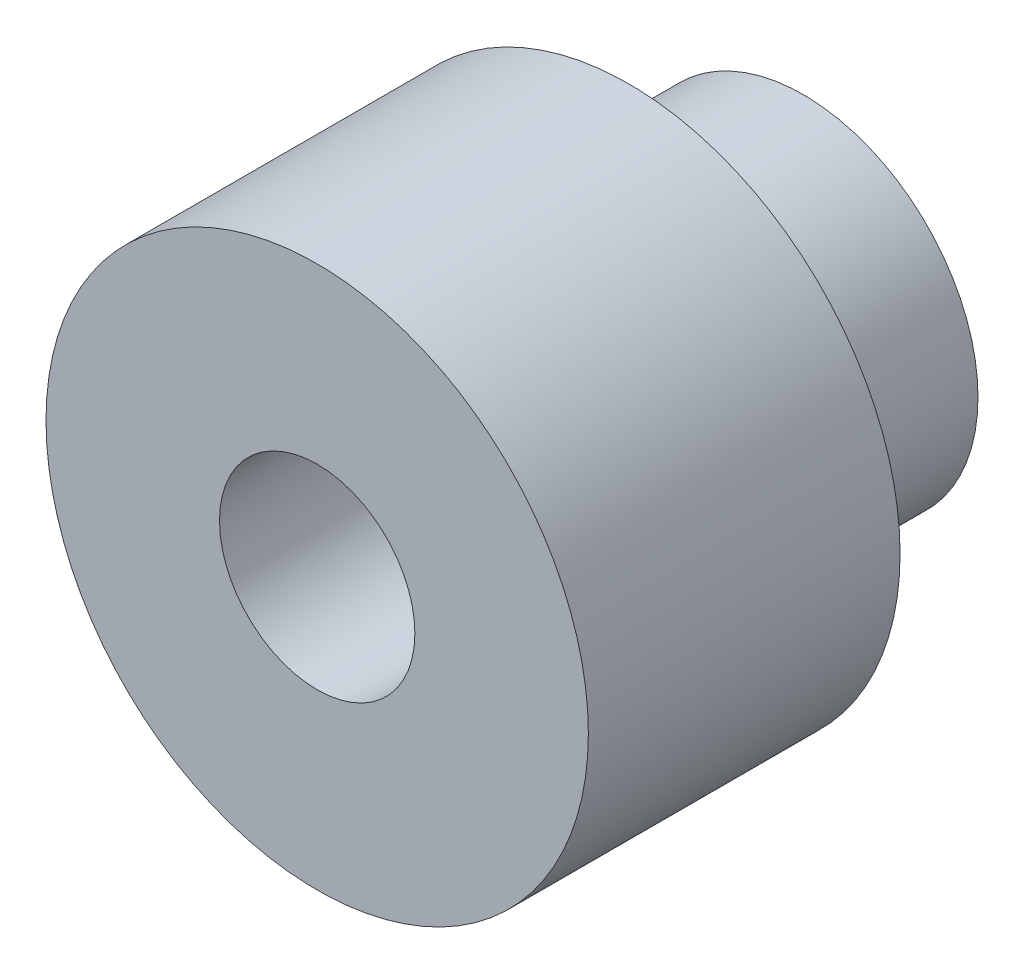
ISO-10303-21;
HEADER;
FILE_DESCRIPTION(('STEP AP214'),'2;1');
FILE_NAME('part.step','',(''),(''),'','','');
FILE_SCHEMA(('AUTOMOTIVE_DESIGN { 1 0 10303 214 1 1 1 1 }'));
ENDSEC;
DATA;
#1=APPLICATION_CONTEXT('core data for automotive mechanical design processes');
#2=APPLICATION_PROTOCOL_DEFINITION('international standard','automotive_design',2000,#1);
#3=PRODUCT_CONTEXT('',#1,'mechanical');
#4=PRODUCT('Part','Part','',(#3));
#5=PRODUCT_RELATED_PRODUCT_CATEGORY('part','',(#4));
#6=PRODUCT_DEFINITION_FORMATION('','',#4);
#7=PRODUCT_DEFINITION_CONTEXT('part definition',#1,'design');
#8=PRODUCT_DEFINITION('design','',#6,#7);
#9=PRODUCT_DEFINITION_SHAPE('','',#8);
#10=(LENGTH_UNIT() NAMED_UNIT(*) SI_UNIT(.MILLI.,.METRE.));
#11=(NAMED_UNIT(*) PLANE_ANGLE_UNIT() SI_UNIT($,.RADIAN.));
#12=(NAMED_UNIT(*) SI_UNIT($,.STERADIAN.) SOLID_ANGLE_UNIT());
#13=UNCERTAINTY_MEASURE_WITH_UNIT(LENGTH_MEASURE(1.E-05),#10,'distance_accuracy_value','');
#14=(GEOMETRIC_REPRESENTATION_CONTEXT(3) GLOBAL_UNCERTAINTY_ASSIGNED_CONTEXT((#13)) GLOBAL_UNIT_ASSIGNED_CONTEXT((#10,
#11,#12)) REPRESENTATION_CONTEXT('',''));
#15=CARTESIAN_POINT('',(0.,0.,0.));
#16=DIRECTION('',(0.,0.,1.));
#17=DIRECTION('',(1.,0.,0.));
#18=AXIS2_PLACEMENT_3D('',#15,#16,#17);
#19=CARTESIAN_POINT('',(-9.07999999999982,33.6438016816891,-51.4686880069965));
#20=DIRECTION('',(0.,0.,-1.));
#21=DIRECTION('',(1.,0.,0.));
#22=AXIS2_PLACEMENT_3D('',#19,#20,#21);
#23=CYLINDRICAL_SURFACE('',#22,0.7835);
#24=CARTESIAN_POINT('',(-9.07999999999982,33.6438016816891,-44.1848016816891));
#25=DIRECTION('',(0.,0.,1.));
#26=DIRECTION('',(1.,0.,0.));
#27=AXIS2_PLACEMENT_3D('',#24,#25,#26);
#28=CIRCLE('',#27,0.7835);
#29=CARTESIAN_POINT('',(-9.86349999999982,33.6438016816891,-44.1848016816891));
#30=VERTEX_POINT('',#29);
#31=EDGE_CURVE('E64',#30,#30,#28,.T.);
#32=ORIENTED_EDGE('',*,*,#31,.T.);
#33=DIRECTION('',(0.,0.,-1.));
#34=VECTOR('',#33,1.);
#35=CARTESIAN_POINT('',(-9.86349999999982,33.6438016816891,-51.4686880069965));
#36=LINE('',#35,#34);
#37=CARTESIAN_POINT('',(-9.86349999999982,33.6438016816891,-48.0848016816891));
#38=VERTEX_POINT('',#37);
#39=EDGE_CURVE('E11',#30,#38,#36,.T.);
#40=ORIENTED_EDGE('',*,*,#39,.T.);
#41=CARTESIAN_POINT('',(-9.07999999999982,33.6438016816891,-48.0848016816891));
#42=DIRECTION('',(0.,0.,1.));
#43=DIRECTION('',(1.,0.,0.));
#44=AXIS2_PLACEMENT_3D('',#41,#42,#43);
#45=CIRCLE('',#44,0.7835);
#46=EDGE_CURVE('E66',#38,#38,#45,.T.);
#47=ORIENTED_EDGE('',*,*,#46,.F.);
#48=ORIENTED_EDGE('',*,*,#39,.F.);
#49=EDGE_LOOP('',(#32,#40,#47,#48));
#50=FACE_BOUND('',#49,.T.);
#51=ADVANCED_FACE('F16',(#50),#23,.F.);
#52=CARTESIAN_POINT('',(-9.07999999999982,33.6438016816891,-48.0848016816891));
#53=DIRECTION('',(0.,0.,1.));
#54=DIRECTION('',(-1.,0.,0.));
#55=AXIS2_PLACEMENT_3D('',#52,#53,#54);
#56=CYLINDRICAL_SURFACE('',#55,1.4);
#57=CARTESIAN_POINT('',(-9.07999999999982,33.6438016816891,-46.6848016816891));
#58=DIRECTION('',(0.,0.,-1.));
#59=DIRECTION('',(-1.,0.,0.));
#60=AXIS2_PLACEMENT_3D('',#57,#58,#59);
#61=CIRCLE('',#60,1.4);
#62=CARTESIAN_POINT('',(-7.67999999999982,33.6438016816891,-46.6848016816891));
#63=VERTEX_POINT('',#62);
#64=EDGE_CURVE('E71',#63,#63,#61,.T.);
#65=ORIENTED_EDGE('',*,*,#64,.T.);
#66=DIRECTION('',(0.,0.,-1.));
#67=VECTOR('',#66,1.);
#68=CARTESIAN_POINT('',(-7.67999999999982,33.6438016816891,-48.0848016816891));
#69=LINE('',#68,#67);
#70=CARTESIAN_POINT('',(-7.67999999999982,33.6438016816891,-48.0848016816891));
#71=VERTEX_POINT('',#70);
#72=EDGE_CURVE('E27',#63,#71,#69,.T.);
#73=ORIENTED_EDGE('',*,*,#72,.T.);
#74=CARTESIAN_POINT('',(-9.07999999999982,33.6438016816891,-48.0848016816891));
#75=DIRECTION('',(0.,0.,-1.));
#76=DIRECTION('',(-1.,0.,0.));
#77=AXIS2_PLACEMENT_3D('',#74,#75,#76);
#78=CIRCLE('',#77,1.4);
#79=EDGE_CURVE('E72',#71,#71,#78,.T.);
#80=ORIENTED_EDGE('',*,*,#79,.F.);
#81=ORIENTED_EDGE('',*,*,#72,.F.);
#82=EDGE_LOOP('',(#65,#73,#80,#81));
#83=FACE_BOUND('',#82,.T.);
#84=ADVANCED_FACE('F89',(#83),#56,.T.);
#85=CARTESIAN_POINT('',(-11.2549999999998,33.6438016816891,-46.6848016816891));
#86=DIRECTION('',(0.,0.,1.));
#87=DIRECTION('',(0.,-1.,0.));
#88=AXIS2_PLACEMENT_3D('',#85,#86,#87);
#89=PLANE('',#88);
#90=ORIENTED_EDGE('',*,*,#64,.F.);
#91=EDGE_LOOP('',(#90));
#92=FACE_BOUND('',#91,.T.);
#93=CARTESIAN_POINT('',(-9.07999999999982,33.6438016816891,-46.6848016816891));
#94=DIRECTION('',(0.,0.,-1.));
#95=DIRECTION('',(-1.,0.,0.));
#96=AXIS2_PLACEMENT_3D('',#93,#94,#95);
#97=CIRCLE('',#96,2.175);
#98=CARTESIAN_POINT('',(-6.90499999999982,33.6438016816891,-46.6848016816891));
#99=VERTEX_POINT('',#98);
#100=EDGE_CURVE('E80',#99,#99,#97,.T.);
#101=ORIENTED_EDGE('',*,*,#100,.T.);
#102=EDGE_LOOP('',(#101));
#103=FACE_BOUND('',#102,.T.);
#104=ADVANCED_FACE('F93',(#92,#103),#89,.F.);
#105=CARTESIAN_POINT('',(-10.4799999999998,33.6438016816891,-48.0848016816891));
#106=DIRECTION('',(0.,0.,1.));
#107=DIRECTION('',(0.,-1.,0.));
#108=AXIS2_PLACEMENT_3D('',#105,#106,#107);
#109=PLANE('',#108);
#110=ORIENTED_EDGE('',*,*,#46,.T.);
#111=EDGE_LOOP('',(#110));
#112=FACE_BOUND('',#111,.T.);
#113=ORIENTED_EDGE('',*,*,#79,.T.);
#114=EDGE_LOOP('',(#113));
#115=FACE_BOUND('',#114,.T.);
#116=ADVANCED_FACE('F68',(#112,#115),#109,.F.);
#117=CARTESIAN_POINT('',(-9.07999999999982,33.6438016816891,-48.0848016816891));
#118=DIRECTION('',(0.,0.,1.));
#119=DIRECTION('',(-1.,0.,0.));
#120=AXIS2_PLACEMENT_3D('',#117,#118,#119);
#121=CYLINDRICAL_SURFACE('',#120,2.175);
#122=CARTESIAN_POINT('',(-9.07999999999982,33.6438016816891,-44.1848016816891));
#123=DIRECTION('',(0.,0.,-1.));
#124=DIRECTION('',(-1.,0.,0.));
#125=AXIS2_PLACEMENT_3D('',#122,#123,#124);
#126=CIRCLE('',#125,2.175);
#127=CARTESIAN_POINT('',(-6.90499999999982,33.6438016816891,-44.1848016816891));
#128=VERTEX_POINT('',#127);
#129=EDGE_CURVE('E83',#128,#128,#126,.T.);
#130=ORIENTED_EDGE('',*,*,#129,.T.);
#131=DIRECTION('',(0.,0.,-1.));
#132=VECTOR('',#131,1.);
#133=CARTESIAN_POINT('',(-6.90499999999982,33.6438016816891,-48.0848016816891));
#134=LINE('',#133,#132);
#135=EDGE_CURVE('E20',#128,#99,#134,.T.);
#136=ORIENTED_EDGE('',*,*,#135,.T.);
#137=ORIENTED_EDGE('',*,*,#100,.F.);
#138=ORIENTED_EDGE('',*,*,#135,.F.);
#139=EDGE_LOOP('',(#130,#136,#137,#138));
#140=FACE_BOUND('',#139,.T.);
#141=ADVANCED_FACE('F92',(#140),#121,.T.);
#142=CARTESIAN_POINT('',(-9.07999999999982,33.6438016816891,-44.1848016816891));
#143=DIRECTION('',(0.,0.,-1.));
#144=DIRECTION('',(0.,-1.,0.));
#145=AXIS2_PLACEMENT_3D('',#142,#143,#144);
#146=PLANE('',#145);
#147=ORIENTED_EDGE('',*,*,#31,.F.);
#148=EDGE_LOOP('',(#147));
#149=FACE_BOUND('',#148,.T.);
#150=ORIENTED_EDGE('',*,*,#129,.F.);
#151=EDGE_LOOP('',(#150));
#152=FACE_BOUND('',#151,.T.);
#153=ADVANCED_FACE('F18',(#149,#152),#146,.F.);
#154=CLOSED_SHELL('',(#51,#84,#104,#116,#141,#153));
#155=MANIFOLD_SOLID_BREP('B1',#154);
#156=ADVANCED_BREP_SHAPE_REPRESENTATION('',(#18,#155),#14);
#157=SHAPE_DEFINITION_REPRESENTATION(#9,#156);
ENDSEC;
END-ISO-10303-21;
